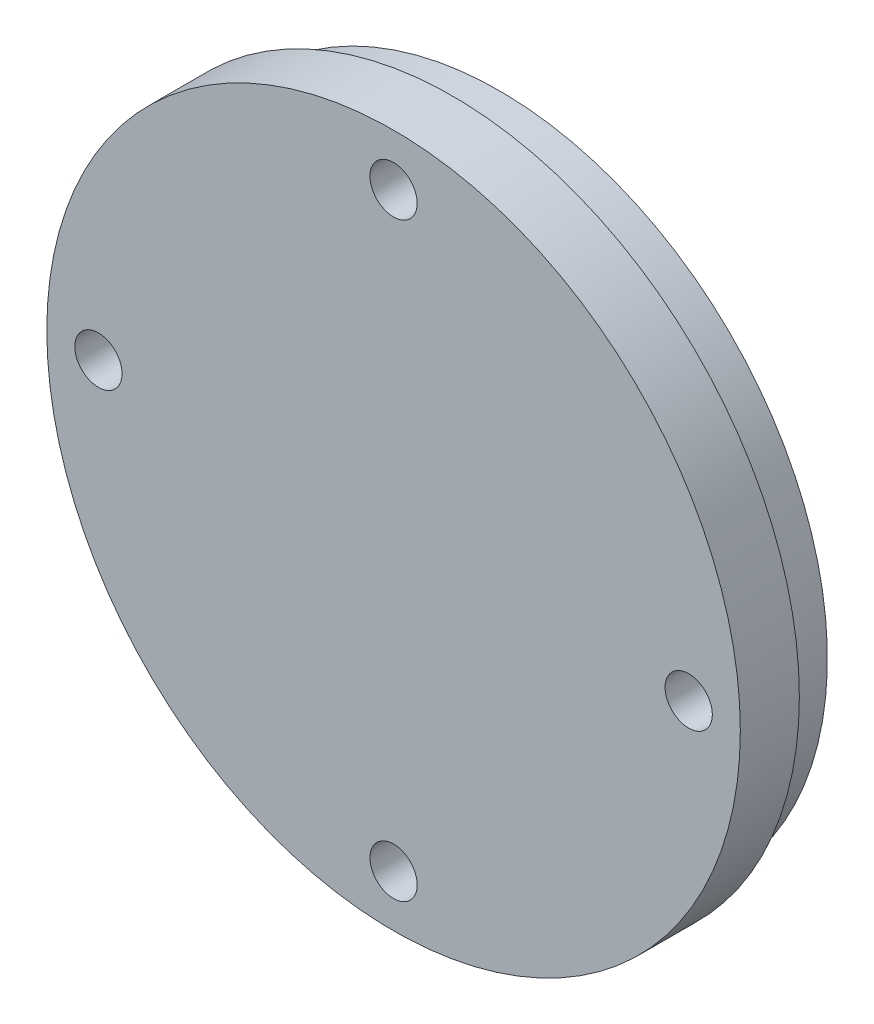
ISO-10303-21;
HEADER;
FILE_DESCRIPTION(('STEP AP214'),'2;1');
FILE_NAME('part.step','',(''),(''),'','','');
FILE_SCHEMA(('AUTOMOTIVE_DESIGN { 1 0 10303 214 1 1 1 1 }'));
ENDSEC;
DATA;
#1=APPLICATION_CONTEXT('core data for automotive mechanical design processes');
#2=APPLICATION_PROTOCOL_DEFINITION('international standard','automotive_design',2000,#1);
#3=PRODUCT_CONTEXT('',#1,'mechanical');
#4=PRODUCT('Part','Part','',(#3));
#5=PRODUCT_RELATED_PRODUCT_CATEGORY('part','',(#4));
#6=PRODUCT_DEFINITION_FORMATION('','',#4);
#7=PRODUCT_DEFINITION_CONTEXT('part definition',#1,'design');
#8=PRODUCT_DEFINITION('design','',#6,#7);
#9=PRODUCT_DEFINITION_SHAPE('','',#8);
#10=(LENGTH_UNIT() NAMED_UNIT(*) SI_UNIT(.MILLI.,.METRE.));
#11=(NAMED_UNIT(*) PLANE_ANGLE_UNIT() SI_UNIT($,.RADIAN.));
#12=(NAMED_UNIT(*) SI_UNIT($,.STERADIAN.) SOLID_ANGLE_UNIT());
#13=UNCERTAINTY_MEASURE_WITH_UNIT(LENGTH_MEASURE(1.E-05),#10,'distance_accuracy_value','');
#14=(GEOMETRIC_REPRESENTATION_CONTEXT(3) GLOBAL_UNCERTAINTY_ASSIGNED_CONTEXT((#13)) GLOBAL_UNIT_ASSIGNED_CONTEXT((#10,
#11,#12)) REPRESENTATION_CONTEXT('',''));
#15=CARTESIAN_POINT('',(0.,0.,0.));
#16=DIRECTION('',(0.,0.,1.));
#17=DIRECTION('',(1.,0.,0.));
#18=AXIS2_PLACEMENT_3D('',#15,#16,#17);
#19=CARTESIAN_POINT('',(0.,0.,4.));
#20=DIRECTION('',(0.,0.,-1.));
#21=DIRECTION('',(-1.,0.,0.));
#22=AXIS2_PLACEMENT_3D('',#19,#20,#21);
#23=CYLINDRICAL_SURFACE('',#22,23.5);
#24=CARTESIAN_POINT('',(0.,0.,4.));
#25=DIRECTION('',(0.,0.,1.));
#26=DIRECTION('',(1.,0.,0.));
#27=AXIS2_PLACEMENT_3D('',#24,#25,#26);
#28=CIRCLE('',#27,23.5);
#29=CARTESIAN_POINT('',(23.5,0.,4.));
#30=VERTEX_POINT('',#29);
#31=EDGE_CURVE('E44',#30,#30,#28,.T.);
#32=ORIENTED_EDGE('',*,*,#31,.F.);
#33=EDGE_LOOP('',(#32));
#34=FACE_BOUND('',#33,.T.);
#35=CARTESIAN_POINT('',(0.,0.,0.));
#36=DIRECTION('',(0.,0.,1.));
#37=DIRECTION('',(1.,0.,0.));
#38=AXIS2_PLACEMENT_3D('',#35,#36,#37);
#39=CIRCLE('',#38,23.5);
#40=CARTESIAN_POINT('',(23.5,0.,0.));
#41=VERTEX_POINT('',#40);
#42=EDGE_CURVE('E40',#41,#41,#39,.T.);
#43=ORIENTED_EDGE('',*,*,#42,.T.);
#44=EDGE_LOOP('',(#43));
#45=FACE_BOUND('',#44,.T.);
#46=ADVANCED_FACE('F37',(#34,#45),#23,.T.);
#47=CARTESIAN_POINT('',(0.,0.,4.));
#48=DIRECTION('',(0.,0.,1.));
#49=DIRECTION('',(1.,0.,0.));
#50=AXIS2_PLACEMENT_3D('',#47,#48,#49);
#51=PLANE('',#50);
#52=CARTESIAN_POINT('',(0.,20.,4.));
#53=DIRECTION('',(0.,0.,-1.));
#54=DIRECTION('',(-1.,0.,0.));
#55=AXIS2_PLACEMENT_3D('',#52,#53,#54);
#56=CIRCLE('',#55,1.6);
#57=CARTESIAN_POINT('',(-1.6,20.,4.));
#58=VERTEX_POINT('',#57);
#59=EDGE_CURVE('E53',#58,#58,#56,.T.);
#60=ORIENTED_EDGE('',*,*,#59,.T.);
#61=EDGE_LOOP('',(#60));
#62=FACE_BOUND('',#61,.T.);
#63=CARTESIAN_POINT('',(-20.,0.,4.));
#64=DIRECTION('',(0.,0.,-1.));
#65=DIRECTION('',(-1.,0.,0.));
#66=AXIS2_PLACEMENT_3D('',#63,#64,#65);
#67=CIRCLE('',#66,1.6);
#68=CARTESIAN_POINT('',(-21.6,0.,4.));
#69=VERTEX_POINT('',#68);
#70=EDGE_CURVE('E69',#69,#69,#67,.T.);
#71=ORIENTED_EDGE('',*,*,#70,.T.);
#72=EDGE_LOOP('',(#71));
#73=FACE_BOUND('',#72,.T.);
#74=CARTESIAN_POINT('',(0.,-20.,4.));
#75=DIRECTION('',(0.,0.,-1.));
#76=DIRECTION('',(-1.,0.,0.));
#77=AXIS2_PLACEMENT_3D('',#74,#75,#76);
#78=CIRCLE('',#77,1.6);
#79=CARTESIAN_POINT('',(-1.6,-20.,4.));
#80=VERTEX_POINT('',#79);
#81=EDGE_CURVE('E63',#80,#80,#78,.T.);
#82=ORIENTED_EDGE('',*,*,#81,.T.);
#83=EDGE_LOOP('',(#82));
#84=FACE_BOUND('',#83,.T.);
#85=CARTESIAN_POINT('',(20.,0.,4.));
#86=DIRECTION('',(0.,0.,-1.));
#87=DIRECTION('',(-1.,0.,0.));
#88=AXIS2_PLACEMENT_3D('',#85,#86,#87);
#89=CIRCLE('',#88,1.6);
#90=CARTESIAN_POINT('',(18.4,0.,4.));
#91=VERTEX_POINT('',#90);
#92=EDGE_CURVE('E57',#91,#91,#89,.T.);
#93=ORIENTED_EDGE('',*,*,#92,.T.);
#94=EDGE_LOOP('',(#93));
#95=FACE_BOUND('',#94,.T.);
#96=ORIENTED_EDGE('',*,*,#31,.T.);
#97=EDGE_LOOP('',(#96));
#98=FACE_BOUND('',#97,.T.);
#99=ADVANCED_FACE('F78',(#62,#73,#84,#95,#98),#51,.T.);
#100=CARTESIAN_POINT('',(0.,0.,0.));
#101=DIRECTION('',(0.,0.,1.));
#102=DIRECTION('',(1.,0.,0.));
#103=AXIS2_PLACEMENT_3D('',#100,#101,#102);
#104=PLANE('',#103);
#105=CARTESIAN_POINT('',(0.,0.,0.));
#106=DIRECTION('',(0.,0.,-1.));
#107=DIRECTION('',(-1.,0.,0.));
#108=AXIS2_PLACEMENT_3D('',#105,#106,#107);
#109=CIRCLE('',#108,22.225);
#110=CARTESIAN_POINT('',(-22.225,0.,0.));
#111=VERTEX_POINT('',#110);
#112=EDGE_CURVE('E10',#111,#111,#109,.T.);
#113=ORIENTED_EDGE('',*,*,#112,.F.);
#114=EDGE_LOOP('',(#113));
#115=FACE_BOUND('',#114,.T.);
#116=ORIENTED_EDGE('',*,*,#42,.F.);
#117=EDGE_LOOP('',(#116));
#118=FACE_BOUND('',#117,.T.);
#119=ADVANCED_FACE('F103',(#115,#118),#104,.F.);
#120=CARTESIAN_POINT('',(0.,0.,-3.175));
#121=DIRECTION('',(0.,0.,1.));
#122=DIRECTION('',(1.,0.,0.));
#123=AXIS2_PLACEMENT_3D('',#120,#121,#122);
#124=CYLINDRICAL_SURFACE('',#123,22.225);
#125=CARTESIAN_POINT('',(0.,0.,-3.175));
#126=DIRECTION('',(0.,0.,-1.));
#127=DIRECTION('',(-1.,0.,0.));
#128=AXIS2_PLACEMENT_3D('',#125,#126,#127);
#129=CIRCLE('',#128,22.225);
#130=CARTESIAN_POINT('',(-22.225,0.,-3.175));
#131=VERTEX_POINT('',#130);
#132=EDGE_CURVE('E50',#131,#131,#129,.T.);
#133=ORIENTED_EDGE('',*,*,#132,.F.);
#134=EDGE_LOOP('',(#133));
#135=FACE_BOUND('',#134,.T.);
#136=ORIENTED_EDGE('',*,*,#112,.T.);
#137=EDGE_LOOP('',(#136));
#138=FACE_BOUND('',#137,.T.);
#139=ADVANCED_FACE('F92',(#135,#138),#124,.T.);
#140=CARTESIAN_POINT('',(0.,0.,-3.175));
#141=DIRECTION('',(0.,0.,-1.));
#142=DIRECTION('',(-1.,0.,0.));
#143=AXIS2_PLACEMENT_3D('',#140,#141,#142);
#144=PLANE('',#143);
#145=CARTESIAN_POINT('',(0.,20.,-3.175));
#146=DIRECTION('',(0.,0.,-1.));
#147=DIRECTION('',(-1.,0.,0.));
#148=AXIS2_PLACEMENT_3D('',#145,#146,#147);
#149=CIRCLE('',#148,1.6);
#150=CARTESIAN_POINT('',(-1.6,20.,-3.175));
#151=VERTEX_POINT('',#150);
#152=EDGE_CURVE('E72',#151,#151,#149,.T.);
#153=ORIENTED_EDGE('',*,*,#152,.F.);
#154=EDGE_LOOP('',(#153));
#155=FACE_BOUND('',#154,.T.);
#156=CARTESIAN_POINT('',(-20.,0.,-3.175));
#157=DIRECTION('',(0.,0.,-1.));
#158=DIRECTION('',(-1.,0.,0.));
#159=AXIS2_PLACEMENT_3D('',#156,#157,#158);
#160=CIRCLE('',#159,1.6);
#161=CARTESIAN_POINT('',(-21.6,0.,-3.175));
#162=VERTEX_POINT('',#161);
#163=EDGE_CURVE('E66',#162,#162,#160,.T.);
#164=ORIENTED_EDGE('',*,*,#163,.F.);
#165=EDGE_LOOP('',(#164));
#166=FACE_BOUND('',#165,.T.);
#167=CARTESIAN_POINT('',(0.,-20.,-3.175));
#168=DIRECTION('',(0.,0.,-1.));
#169=DIRECTION('',(-1.,0.,0.));
#170=AXIS2_PLACEMENT_3D('',#167,#168,#169);
#171=CIRCLE('',#170,1.6);
#172=CARTESIAN_POINT('',(-1.6,-20.,-3.175));
#173=VERTEX_POINT('',#172);
#174=EDGE_CURVE('E60',#173,#173,#171,.T.);
#175=ORIENTED_EDGE('',*,*,#174,.F.);
#176=EDGE_LOOP('',(#175));
#177=FACE_BOUND('',#176,.T.);
#178=CARTESIAN_POINT('',(20.,0.,-3.175));
#179=DIRECTION('',(0.,0.,-1.));
#180=DIRECTION('',(-1.,0.,0.));
#181=AXIS2_PLACEMENT_3D('',#178,#179,#180);
#182=CIRCLE('',#181,1.6);
#183=CARTESIAN_POINT('',(18.4,0.,-3.175));
#184=VERTEX_POINT('',#183);
#185=EDGE_CURVE('E54',#184,#184,#182,.T.);
#186=ORIENTED_EDGE('',*,*,#185,.F.);
#187=EDGE_LOOP('',(#186));
#188=FACE_BOUND('',#187,.T.);
#189=ORIENTED_EDGE('',*,*,#132,.T.);
#190=EDGE_LOOP('',(#189));
#191=FACE_BOUND('',#190,.T.);
#192=ADVANCED_FACE('F88',(#155,#166,#177,#188,#191),#144,.T.);
#193=CARTESIAN_POINT('',(20.,0.,4.));
#194=DIRECTION('',(0.,0.,-1.));
#195=DIRECTION('',(-1.,0.,0.));
#196=AXIS2_PLACEMENT_3D('',#193,#194,#195);
#197=CYLINDRICAL_SURFACE('',#196,1.6);
#198=ORIENTED_EDGE('',*,*,#92,.F.);
#199=EDGE_LOOP('',(#198));
#200=FACE_BOUND('',#199,.T.);
#201=ORIENTED_EDGE('',*,*,#185,.T.);
#202=EDGE_LOOP('',(#201));
#203=FACE_BOUND('',#202,.T.);
#204=ADVANCED_FACE('F91',(#200,#203),#197,.F.);
#205=CARTESIAN_POINT('',(0.,-20.,4.));
#206=DIRECTION('',(0.,0.,-1.));
#207=DIRECTION('',(-1.,0.,0.));
#208=AXIS2_PLACEMENT_3D('',#205,#206,#207);
#209=CYLINDRICAL_SURFACE('',#208,1.6);
#210=ORIENTED_EDGE('',*,*,#81,.F.);
#211=EDGE_LOOP('',(#210));
#212=FACE_BOUND('',#211,.T.);
#213=ORIENTED_EDGE('',*,*,#174,.T.);
#214=EDGE_LOOP('',(#213));
#215=FACE_BOUND('',#214,.T.);
#216=ADVANCED_FACE('F148',(#212,#215),#209,.F.);
#217=CARTESIAN_POINT('',(-20.,0.,4.));
#218=DIRECTION('',(0.,0.,-1.));
#219=DIRECTION('',(-1.,0.,0.));
#220=AXIS2_PLACEMENT_3D('',#217,#218,#219);
#221=CYLINDRICAL_SURFACE('',#220,1.6);
#222=ORIENTED_EDGE('',*,*,#70,.F.);
#223=EDGE_LOOP('',(#222));
#224=FACE_BOUND('',#223,.T.);
#225=ORIENTED_EDGE('',*,*,#163,.T.);
#226=EDGE_LOOP('',(#225));
#227=FACE_BOUND('',#226,.T.);
#228=ADVANCED_FACE('F84',(#224,#227),#221,.F.);
#229=CARTESIAN_POINT('',(0.,20.,4.));
#230=DIRECTION('',(0.,0.,-1.));
#231=DIRECTION('',(-1.,0.,0.));
#232=AXIS2_PLACEMENT_3D('',#229,#230,#231);
#233=CYLINDRICAL_SURFACE('',#232,1.6);
#234=ORIENTED_EDGE('',*,*,#59,.F.);
#235=EDGE_LOOP('',(#234));
#236=FACE_BOUND('',#235,.T.);
#237=ORIENTED_EDGE('',*,*,#152,.T.);
#238=EDGE_LOOP('',(#237));
#239=FACE_BOUND('',#238,.T.);
#240=ADVANCED_FACE('F81',(#236,#239),#233,.F.);
#241=CLOSED_SHELL('',(#46,#99,#119,#139,#192,#204,#216,#228,#240));
#242=MANIFOLD_SOLID_BREP('B2',#241);
#243=ADVANCED_BREP_SHAPE_REPRESENTATION('',(#18,#242),#14);
#244=SHAPE_DEFINITION_REPRESENTATION(#9,#243);
ENDSEC;
END-ISO-10303-21;
